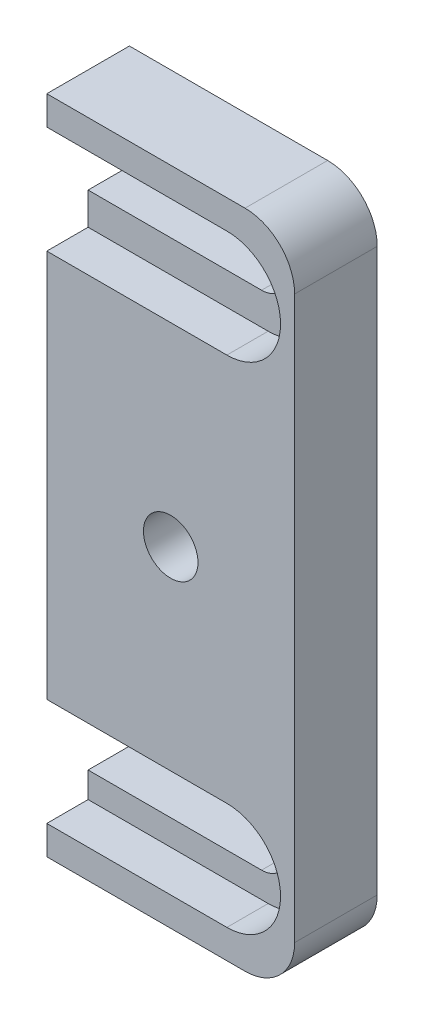
ISO-10303-21;
HEADER;
FILE_DESCRIPTION(('STEP AP214'),'2;1');
FILE_NAME('part.step','',(''),(''),'','','');
FILE_SCHEMA(('AUTOMOTIVE_DESIGN { 1 0 10303 214 1 1 1 1 }'));
ENDSEC;
DATA;
#1=APPLICATION_CONTEXT('core data for automotive mechanical design processes');
#2=APPLICATION_PROTOCOL_DEFINITION('international standard','automotive_design',2000,#1);
#3=PRODUCT_CONTEXT('',#1,'mechanical');
#4=PRODUCT('Part','Part','',(#3));
#5=PRODUCT_RELATED_PRODUCT_CATEGORY('part','',(#4));
#6=PRODUCT_DEFINITION_FORMATION('','',#4);
#7=PRODUCT_DEFINITION_CONTEXT('part definition',#1,'design');
#8=PRODUCT_DEFINITION('design','',#6,#7);
#9=PRODUCT_DEFINITION_SHAPE('','',#8);
#10=(LENGTH_UNIT() NAMED_UNIT(*) SI_UNIT(.MILLI.,.METRE.));
#11=(NAMED_UNIT(*) PLANE_ANGLE_UNIT() SI_UNIT($,.RADIAN.));
#12=(NAMED_UNIT(*) SI_UNIT($,.STERADIAN.) SOLID_ANGLE_UNIT());
#13=UNCERTAINTY_MEASURE_WITH_UNIT(LENGTH_MEASURE(1.E-05),#10,'distance_accuracy_value','');
#14=(GEOMETRIC_REPRESENTATION_CONTEXT(3) GLOBAL_UNCERTAINTY_ASSIGNED_CONTEXT((#13)) GLOBAL_UNIT_ASSIGNED_CONTEXT((#10,
#11,#12)) REPRESENTATION_CONTEXT('',''));
#15=CARTESIAN_POINT('',(0.,0.,0.));
#16=DIRECTION('',(0.,0.,1.));
#17=DIRECTION('',(1.,0.,0.));
#18=AXIS2_PLACEMENT_3D('',#15,#16,#17);
#19=CARTESIAN_POINT('',(-7.50000000000001,16.7,5.));
#20=DIRECTION('',(1.,0.,0.));
#21=DIRECTION('',(0.,1.,0.));
#22=AXIS2_PLACEMENT_3D('',#19,#20,#21);
#23=PLANE('',#22);
#24=DIRECTION('',(0.,0.,1.));
#25=VECTOR('',#24,1.);
#26=CARTESIAN_POINT('',(-7.5,18.25,2.5));
#27=LINE('',#26,#25);
#28=CARTESIAN_POINT('',(-7.5,18.25,2.5));
#29=VERTEX_POINT('',#28);
#30=CARTESIAN_POINT('',(-7.5,18.25,5.));
#31=VERTEX_POINT('',#30);
#32=EDGE_CURVE('E265',#29,#31,#27,.T.);
#33=ORIENTED_EDGE('',*,*,#32,.T.);
#34=DIRECTION('',(0.,-1.,0.));
#35=VECTOR('',#34,1.);
#36=CARTESIAN_POINT('',(-7.50000000000001,16.7,5.));
#37=LINE('',#36,#35);
#38=CARTESIAN_POINT('',(-7.5,20.,5.));
#39=VERTEX_POINT('',#38);
#40=EDGE_CURVE('E288',#39,#31,#37,.T.);
#41=ORIENTED_EDGE('',*,*,#40,.F.);
#42=DIRECTION('',(0.,0.,-1.));
#43=VECTOR('',#42,1.);
#44=CARTESIAN_POINT('',(-7.5,20.,5.));
#45=LINE('',#44,#43);
#46=CARTESIAN_POINT('',(-7.5,20.,0.));
#47=VERTEX_POINT('',#46);
#48=EDGE_CURVE('E345',#39,#47,#45,.T.);
#49=ORIENTED_EDGE('',*,*,#48,.T.);
#50=DIRECTION('',(0.,-1.,0.));
#51=VECTOR('',#50,1.);
#52=CARTESIAN_POINT('',(-7.50000000000001,16.7,0.));
#53=LINE('',#52,#51);
#54=CARTESIAN_POINT('',(-7.50000000000001,16.7,0.));
#55=VERTEX_POINT('',#54);
#56=EDGE_CURVE('E307',#47,#55,#53,.T.);
#57=ORIENTED_EDGE('',*,*,#56,.T.);
#58=DIRECTION('',(0.,0.,-1.));
#59=VECTOR('',#58,1.);
#60=CARTESIAN_POINT('',(-7.50000000000001,16.7,5.));
#61=LINE('',#60,#59);
#62=CARTESIAN_POINT('',(-7.50000000000001,16.7,2.5));
#63=VERTEX_POINT('',#62);
#64=EDGE_CURVE('E343',#63,#55,#61,.T.);
#65=ORIENTED_EDGE('',*,*,#64,.F.);
#66=DIRECTION('',(0.,-1.,0.));
#67=VECTOR('',#66,1.);
#68=CARTESIAN_POINT('',(-7.50000000000003,0.,2.5));
#69=LINE('',#68,#67);
#70=EDGE_CURVE('E241',#29,#63,#69,.T.);
#71=ORIENTED_EDGE('',*,*,#70,.F.);
#72=EDGE_LOOP('',(#33,#41,#49,#57,#65,#71));
#73=FACE_BOUND('',#72,.T.);
#74=ADVANCED_FACE('F39',(#73),#23,.F.);
#75=CARTESIAN_POINT('',(-7.50000000000001,16.7,5.));
#76=DIRECTION('',(0.,1.,0.));
#77=DIRECTION('',(0.,0.,1.));
#78=AXIS2_PLACEMENT_3D('',#75,#76,#77);
#79=PLANE('',#78);
#80=DIRECTION('',(1.,0.,0.));
#81=VECTOR('',#80,1.);
#82=CARTESIAN_POINT('',(0.,16.7,2.5));
#83=LINE('',#82,#81);
#84=CARTESIAN_POINT('',(2.99999999999999,16.7,2.5));
#85=VERTEX_POINT('',#84);
#86=EDGE_CURVE('E243',#63,#85,#83,.T.);
#87=ORIENTED_EDGE('',*,*,#86,.F.);
#88=ORIENTED_EDGE('',*,*,#64,.T.);
#89=DIRECTION('',(1.,0.,0.));
#90=VECTOR('',#89,1.);
#91=CARTESIAN_POINT('',(-7.50000000000001,16.7,0.));
#92=LINE('',#91,#90);
#93=CARTESIAN_POINT('',(2.99999999999999,16.7,0.));
#94=VERTEX_POINT('',#93);
#95=EDGE_CURVE('E310',#55,#94,#92,.T.);
#96=ORIENTED_EDGE('',*,*,#95,.T.);
#97=DIRECTION('',(0.,0.,-1.));
#98=VECTOR('',#97,1.);
#99=CARTESIAN_POINT('',(2.99999999999999,16.7,5.));
#100=LINE('',#99,#98);
#101=EDGE_CURVE('E341',#85,#94,#100,.T.);
#102=ORIENTED_EDGE('',*,*,#101,.F.);
#103=EDGE_LOOP('',(#87,#88,#96,#102));
#104=FACE_BOUND('',#103,.T.);
#105=ADVANCED_FACE('F422',(#104),#79,.F.);
#106=CARTESIAN_POINT('',(3.,15.2,5.));
#107=DIRECTION('',(0.,0.,-1.));
#108=DIRECTION('',(-1.,0.,0.));
#109=AXIS2_PLACEMENT_3D('',#106,#107,#108);
#110=CYLINDRICAL_SURFACE('',#109,1.5);
#111=CARTESIAN_POINT('',(3.,15.2,2.5));
#112=DIRECTION('',(0.,0.,1.));
#113=DIRECTION('',(1.,0.,0.));
#114=AXIS2_PLACEMENT_3D('',#111,#112,#113);
#115=CIRCLE('',#114,1.5);
#116=CARTESIAN_POINT('',(3.,13.7,2.5));
#117=VERTEX_POINT('',#116);
#118=EDGE_CURVE('E245',#85,#117,#115,.F.);
#119=ORIENTED_EDGE('',*,*,#118,.F.);
#120=ORIENTED_EDGE('',*,*,#101,.T.);
#121=CARTESIAN_POINT('',(3.,15.2,0.));
#122=DIRECTION('',(0.,0.,-1.));
#123=DIRECTION('',(1.,0.,0.));
#124=AXIS2_PLACEMENT_3D('',#121,#122,#123);
#125=CIRCLE('',#124,1.5);
#126=CARTESIAN_POINT('',(3.,13.7,0.));
#127=VERTEX_POINT('',#126);
#128=EDGE_CURVE('E313',#94,#127,#125,.T.);
#129=ORIENTED_EDGE('',*,*,#128,.T.);
#130=DIRECTION('',(0.,0.,-1.));
#131=VECTOR('',#130,1.);
#132=CARTESIAN_POINT('',(3.,13.7,5.));
#133=LINE('',#132,#131);
#134=EDGE_CURVE('E339',#117,#127,#133,.T.);
#135=ORIENTED_EDGE('',*,*,#134,.F.);
#136=EDGE_LOOP('',(#119,#120,#129,#135));
#137=FACE_BOUND('',#136,.T.);
#138=ADVANCED_FACE('F416',(#137),#110,.F.);
#139=CARTESIAN_POINT('',(-7.5,13.7,5.));
#140=DIRECTION('',(0.,-1.,0.));
#141=DIRECTION('',(1.,0.,0.));
#142=AXIS2_PLACEMENT_3D('',#139,#140,#141);
#143=PLANE('',#142);
#144=DIRECTION('',(-1.,0.,0.));
#145=VECTOR('',#144,1.);
#146=CARTESIAN_POINT('',(0.,13.7,2.5));
#147=LINE('',#146,#145);
#148=CARTESIAN_POINT('',(-7.5,13.7,2.5));
#149=VERTEX_POINT('',#148);
#150=EDGE_CURVE('E54',#117,#149,#147,.T.);
#151=ORIENTED_EDGE('',*,*,#150,.F.);
#152=ORIENTED_EDGE('',*,*,#134,.T.);
#153=DIRECTION('',(-1.,0.,0.));
#154=VECTOR('',#153,1.);
#155=CARTESIAN_POINT('',(-7.5,13.7,0.));
#156=LINE('',#155,#154);
#157=CARTESIAN_POINT('',(-7.5,13.7,0.));
#158=VERTEX_POINT('',#157);
#159=EDGE_CURVE('E316',#127,#158,#156,.T.);
#160=ORIENTED_EDGE('',*,*,#159,.T.);
#161=DIRECTION('',(0.,0.,-1.));
#162=VECTOR('',#161,1.);
#163=CARTESIAN_POINT('',(-7.5,13.7,5.));
#164=LINE('',#163,#162);
#165=EDGE_CURVE('E337',#149,#158,#164,.T.);
#166=ORIENTED_EDGE('',*,*,#165,.F.);
#167=EDGE_LOOP('',(#151,#152,#160,#166));
#168=FACE_BOUND('',#167,.T.);
#169=ADVANCED_FACE('F412',(#168),#143,.F.);
#170=CARTESIAN_POINT('',(-7.5,-13.7,5.));
#171=DIRECTION('',(1.,0.,0.));
#172=DIRECTION('',(0.,0.,-1.));
#173=AXIS2_PLACEMENT_3D('',#170,#171,#172);
#174=PLANE('',#173);
#175=DIRECTION('',(0.,0.,1.));
#176=VECTOR('',#175,1.);
#177=CARTESIAN_POINT('',(-7.5,-11.75,2.5));
#178=LINE('',#177,#176);
#179=CARTESIAN_POINT('',(-7.5,-11.75,2.5));
#180=VERTEX_POINT('',#179);
#181=CARTESIAN_POINT('',(-7.5,-11.75,5.));
#182=VERTEX_POINT('',#181);
#183=EDGE_CURVE('E232',#180,#182,#178,.T.);
#184=ORIENTED_EDGE('',*,*,#183,.T.);
#185=DIRECTION('',(0.,-1.,0.));
#186=VECTOR('',#185,1.);
#187=CARTESIAN_POINT('',(-7.5,-13.7,5.));
#188=LINE('',#187,#186);
#189=CARTESIAN_POINT('',(-7.5,11.75,5.));
#190=VERTEX_POINT('',#189);
#191=EDGE_CURVE('E291',#190,#182,#188,.T.);
#192=ORIENTED_EDGE('',*,*,#191,.F.);
#193=DIRECTION('',(0.,0.,1.));
#194=VECTOR('',#193,1.);
#195=CARTESIAN_POINT('',(-7.5,11.75,2.5));
#196=LINE('',#195,#194);
#197=CARTESIAN_POINT('',(-7.5,11.75,2.5));
#198=VERTEX_POINT('',#197);
#199=EDGE_CURVE('E263',#198,#190,#196,.T.);
#200=ORIENTED_EDGE('',*,*,#199,.F.);
#201=DIRECTION('',(0.,-1.,0.));
#202=VECTOR('',#201,1.);
#203=CARTESIAN_POINT('',(-7.5,0.,2.5));
#204=LINE('',#203,#202);
#205=EDGE_CURVE('E248',#149,#198,#204,.T.);
#206=ORIENTED_EDGE('',*,*,#205,.F.);
#207=ORIENTED_EDGE('',*,*,#165,.T.);
#208=DIRECTION('',(0.,-1.,0.));
#209=VECTOR('',#208,1.);
#210=CARTESIAN_POINT('',(-7.5,-13.7,0.));
#211=LINE('',#210,#209);
#212=CARTESIAN_POINT('',(-7.5,-13.7,0.));
#213=VERTEX_POINT('',#212);
#214=EDGE_CURVE('E319',#158,#213,#211,.T.);
#215=ORIENTED_EDGE('',*,*,#214,.T.);
#216=DIRECTION('',(0.,0.,-1.));
#217=VECTOR('',#216,1.);
#218=CARTESIAN_POINT('',(-7.5,-13.7,5.));
#219=LINE('',#218,#217);
#220=CARTESIAN_POINT('',(-7.5,-13.7,2.5));
#221=VERTEX_POINT('',#220);
#222=EDGE_CURVE('E335',#221,#213,#219,.T.);
#223=ORIENTED_EDGE('',*,*,#222,.F.);
#224=DIRECTION('',(0.,-1.,0.));
#225=VECTOR('',#224,1.);
#226=CARTESIAN_POINT('',(-7.5,0.,2.5));
#227=LINE('',#226,#225);
#228=EDGE_CURVE('E218',#180,#221,#227,.T.);
#229=ORIENTED_EDGE('',*,*,#228,.F.);
#230=EDGE_LOOP('',(#184,#192,#200,#206,#207,#215,#223,#229));
#231=FACE_BOUND('',#230,.T.);
#232=ADVANCED_FACE('F407',(#231),#174,.F.);
#233=CARTESIAN_POINT('',(-7.5,-13.7,5.));
#234=DIRECTION('',(0.,1.,0.));
#235=DIRECTION('',(0.,0.,1.));
#236=AXIS2_PLACEMENT_3D('',#233,#234,#235);
#237=PLANE('',#236);
#238=DIRECTION('',(1.,0.,0.));
#239=VECTOR('',#238,1.);
#240=CARTESIAN_POINT('',(0.,-13.7,2.5));
#241=LINE('',#240,#239);
#242=CARTESIAN_POINT('',(3.,-13.7,2.5));
#243=VERTEX_POINT('',#242);
#244=EDGE_CURVE('E220',#221,#243,#241,.T.);
#245=ORIENTED_EDGE('',*,*,#244,.F.);
#246=ORIENTED_EDGE('',*,*,#222,.T.);
#247=DIRECTION('',(1.,0.,0.));
#248=VECTOR('',#247,1.);
#249=CARTESIAN_POINT('',(-7.5,-13.7,0.));
#250=LINE('',#249,#248);
#251=CARTESIAN_POINT('',(3.,-13.7,0.));
#252=VERTEX_POINT('',#251);
#253=EDGE_CURVE('E322',#213,#252,#250,.T.);
#254=ORIENTED_EDGE('',*,*,#253,.T.);
#255=DIRECTION('',(0.,0.,-1.));
#256=VECTOR('',#255,1.);
#257=CARTESIAN_POINT('',(3.,-13.7,5.));
#258=LINE('',#257,#256);
#259=EDGE_CURVE('E333',#243,#252,#258,.T.);
#260=ORIENTED_EDGE('',*,*,#259,.F.);
#261=EDGE_LOOP('',(#245,#246,#254,#260));
#262=FACE_BOUND('',#261,.T.);
#263=ADVANCED_FACE('F401',(#262),#237,.F.);
#264=CARTESIAN_POINT('',(3.,-15.2,5.));
#265=DIRECTION('',(0.,0.,-1.));
#266=DIRECTION('',(-1.,0.,0.));
#267=AXIS2_PLACEMENT_3D('',#264,#265,#266);
#268=CYLINDRICAL_SURFACE('',#267,1.5);
#269=CARTESIAN_POINT('',(3.,-15.2,2.5));
#270=DIRECTION('',(0.,0.,1.));
#271=DIRECTION('',(1.,0.,0.));
#272=AXIS2_PLACEMENT_3D('',#269,#270,#271);
#273=CIRCLE('',#272,1.5);
#274=CARTESIAN_POINT('',(3.,-16.7,2.5));
#275=VERTEX_POINT('',#274);
#276=EDGE_CURVE('E62',#243,#275,#273,.F.);
#277=ORIENTED_EDGE('',*,*,#276,.F.);
#278=ORIENTED_EDGE('',*,*,#259,.T.);
#279=CARTESIAN_POINT('',(3.,-15.2,0.));
#280=DIRECTION('',(0.,0.,-1.));
#281=DIRECTION('',(-1.,0.,0.));
#282=AXIS2_PLACEMENT_3D('',#279,#280,#281);
#283=CIRCLE('',#282,1.5);
#284=CARTESIAN_POINT('',(3.,-16.7,0.));
#285=VERTEX_POINT('',#284);
#286=EDGE_CURVE('E325',#252,#285,#283,.T.);
#287=ORIENTED_EDGE('',*,*,#286,.T.);
#288=DIRECTION('',(0.,0.,-1.));
#289=VECTOR('',#288,1.);
#290=CARTESIAN_POINT('',(3.,-16.7,5.));
#291=LINE('',#290,#289);
#292=EDGE_CURVE('E331',#275,#285,#291,.T.);
#293=ORIENTED_EDGE('',*,*,#292,.F.);
#294=EDGE_LOOP('',(#277,#278,#287,#293));
#295=FACE_BOUND('',#294,.T.);
#296=ADVANCED_FACE('F397',(#295),#268,.F.);
#297=CARTESIAN_POINT('',(-7.5,-16.7,5.));
#298=DIRECTION('',(0.,-1.,0.));
#299=DIRECTION('',(0.,0.,-1.));
#300=AXIS2_PLACEMENT_3D('',#297,#298,#299);
#301=PLANE('',#300);
#302=DIRECTION('',(-1.,0.,0.));
#303=VECTOR('',#302,1.);
#304=CARTESIAN_POINT('',(0.,-16.7,2.5));
#305=LINE('',#304,#303);
#306=CARTESIAN_POINT('',(-7.5,-16.7,2.5));
#307=VERTEX_POINT('',#306);
#308=EDGE_CURVE('E223',#275,#307,#305,.T.);
#309=ORIENTED_EDGE('',*,*,#308,.F.);
#310=ORIENTED_EDGE('',*,*,#292,.T.);
#311=DIRECTION('',(-1.,0.,0.));
#312=VECTOR('',#311,1.);
#313=CARTESIAN_POINT('',(-7.5,-16.7,0.));
#314=LINE('',#313,#312);
#315=CARTESIAN_POINT('',(-7.5,-16.7,0.));
#316=VERTEX_POINT('',#315);
#317=EDGE_CURVE('E278',#285,#316,#314,.T.);
#318=ORIENTED_EDGE('',*,*,#317,.T.);
#319=DIRECTION('',(0.,0.,-1.));
#320=VECTOR('',#319,1.);
#321=CARTESIAN_POINT('',(-7.5,-16.7,5.));
#322=LINE('',#321,#320);
#323=EDGE_CURVE('E294',#307,#316,#322,.T.);
#324=ORIENTED_EDGE('',*,*,#323,.F.);
#325=EDGE_LOOP('',(#309,#310,#318,#324));
#326=FACE_BOUND('',#325,.T.);
#327=ADVANCED_FACE('F394',(#326),#301,.F.);
#328=CARTESIAN_POINT('',(3.,-15.2,5.));
#329=DIRECTION('',(0.,0.,-1.));
#330=DIRECTION('',(-1.,0.,0.));
#331=AXIS2_PLACEMENT_3D('',#328,#329,#330);
#332=PLANE('',#331);
#333=CARTESIAN_POINT('',(3.4,-15.,5.));
#334=DIRECTION('',(0.,0.,1.));
#335=DIRECTION('',(1.,0.,0.));
#336=AXIS2_PLACEMENT_3D('',#333,#334,#335);
#337=CIRCLE('',#336,3.25);
#338=CARTESIAN_POINT('',(3.4,-18.25,5.));
#339=VERTEX_POINT('',#338);
#340=CARTESIAN_POINT('',(3.4,-11.75,5.));
#341=VERTEX_POINT('',#340);
#342=EDGE_CURVE('E214',#339,#341,#337,.T.);
#343=ORIENTED_EDGE('',*,*,#342,.F.);
#344=DIRECTION('',(1.,0.,0.));
#345=VECTOR('',#344,1.);
#346=CARTESIAN_POINT('',(0.,-18.25,5.));
#347=LINE('',#346,#345);
#348=CARTESIAN_POINT('',(-7.5,-18.25,5.));
#349=VERTEX_POINT('',#348);
#350=EDGE_CURVE('E194',#349,#339,#347,.T.);
#351=ORIENTED_EDGE('',*,*,#350,.F.);
#352=DIRECTION('',(0.,-1.,0.));
#353=VECTOR('',#352,1.);
#354=CARTESIAN_POINT('',(-7.5,-20.,5.));
#355=LINE('',#354,#353);
#356=CARTESIAN_POINT('',(-7.5,-20.,5.));
#357=VERTEX_POINT('',#356);
#358=EDGE_CURVE('E275',#349,#357,#355,.T.);
#359=ORIENTED_EDGE('',*,*,#358,.T.);
#360=DIRECTION('',(1.,0.,0.));
#361=VECTOR('',#360,1.);
#362=CARTESIAN_POINT('',(-7.5,-20.,5.));
#363=LINE('',#362,#361);
#364=CARTESIAN_POINT('',(4.49999999999998,-20.,5.));
#365=VERTEX_POINT('',#364);
#366=EDGE_CURVE('E277',#357,#365,#363,.T.);
#367=ORIENTED_EDGE('',*,*,#366,.T.);
#368=CARTESIAN_POINT('',(4.5,-17.,5.));
#369=DIRECTION('',(0.,0.,1.));
#370=DIRECTION('',(-1.,0.,0.));
#371=AXIS2_PLACEMENT_3D('',#368,#369,#370);
#372=CIRCLE('',#371,3.);
#373=CARTESIAN_POINT('',(7.5,-17.,5.));
#374=VERTEX_POINT('',#373);
#375=EDGE_CURVE('E280',#365,#374,#372,.T.);
#376=ORIENTED_EDGE('',*,*,#375,.T.);
#377=DIRECTION('',(0.,1.,0.));
#378=VECTOR('',#377,1.);
#379=CARTESIAN_POINT('',(7.5,-17.,5.));
#380=LINE('',#379,#378);
#381=CARTESIAN_POINT('',(7.5,17.,5.));
#382=VERTEX_POINT('',#381);
#383=EDGE_CURVE('E282',#374,#382,#380,.T.);
#384=ORIENTED_EDGE('',*,*,#383,.T.);
#385=CARTESIAN_POINT('',(4.5,17.,5.));
#386=DIRECTION('',(0.,0.,1.));
#387=DIRECTION('',(1.,0.,0.));
#388=AXIS2_PLACEMENT_3D('',#385,#386,#387);
#389=CIRCLE('',#388,3.);
#390=CARTESIAN_POINT('',(4.49999999999998,20.,5.));
#391=VERTEX_POINT('',#390);
#392=EDGE_CURVE('E284',#382,#391,#389,.T.);
#393=ORIENTED_EDGE('',*,*,#392,.T.);
#394=DIRECTION('',(-1.,0.,0.));
#395=VECTOR('',#394,1.);
#396=CARTESIAN_POINT('',(-7.5,20.,5.));
#397=LINE('',#396,#395);
#398=EDGE_CURVE('E286',#391,#39,#397,.T.);
#399=ORIENTED_EDGE('',*,*,#398,.T.);
#400=ORIENTED_EDGE('',*,*,#40,.T.);
#401=DIRECTION('',(1.,0.,0.));
#402=VECTOR('',#401,1.);
#403=CARTESIAN_POINT('',(0.,18.25,5.));
#404=LINE('',#403,#402);
#405=CARTESIAN_POINT('',(3.4,18.25,5.));
#406=VERTEX_POINT('',#405);
#407=EDGE_CURVE('E257',#31,#406,#404,.T.);
#408=ORIENTED_EDGE('',*,*,#407,.T.);
#409=CARTESIAN_POINT('',(3.4,15.,5.));
#410=DIRECTION('',(0.,0.,1.));
#411=DIRECTION('',(1.,0.,0.));
#412=AXIS2_PLACEMENT_3D('',#409,#410,#411);
#413=CIRCLE('',#412,3.25);
#414=CARTESIAN_POINT('',(3.4,11.75,5.));
#415=VERTEX_POINT('',#414);
#416=EDGE_CURVE('E254',#406,#415,#413,.F.);
#417=ORIENTED_EDGE('',*,*,#416,.T.);
#418=DIRECTION('',(1.,0.,0.));
#419=VECTOR('',#418,1.);
#420=CARTESIAN_POINT('',(0.,11.75,5.));
#421=LINE('',#420,#419);
#422=EDGE_CURVE('E239',#190,#415,#421,.T.);
#423=ORIENTED_EDGE('',*,*,#422,.F.);
#424=ORIENTED_EDGE('',*,*,#191,.T.);
#425=DIRECTION('',(1.,0.,0.));
#426=VECTOR('',#425,1.);
#427=CARTESIAN_POINT('',(0.,-11.75,5.));
#428=LINE('',#427,#426);
#429=EDGE_CURVE('E211',#182,#341,#428,.T.);
#430=ORIENTED_EDGE('',*,*,#429,.T.);
#431=EDGE_LOOP('',(#343,#351,#359,#367,#376,#384,#393,#399,#400,#408,#417,#423,#424,#430));
#432=FACE_BOUND('',#431,.T.);
#433=CARTESIAN_POINT('',(0.,0.,5.));
#434=DIRECTION('',(0.,0.,1.));
#435=DIRECTION('',(1.,0.,0.));
#436=AXIS2_PLACEMENT_3D('',#433,#434,#435);
#437=CIRCLE('',#436,1.65);
#438=CARTESIAN_POINT('',(1.65,0.,5.));
#439=VERTEX_POINT('',#438);
#440=EDGE_CURVE('E269',#439,#439,#437,.T.);
#441=ORIENTED_EDGE('',*,*,#440,.F.);
#442=EDGE_LOOP('',(#441));
#443=FACE_BOUND('',#442,.T.);
#444=ADVANCED_FACE('F382',(#432,#443),#332,.F.);
#445=CARTESIAN_POINT('',(3.,-15.2,0.));
#446=DIRECTION('',(0.,0.,-1.));
#447=DIRECTION('',(-1.,0.,0.));
#448=AXIS2_PLACEMENT_3D('',#445,#446,#447);
#449=PLANE('',#448);
#450=DIRECTION('',(0.,-1.,0.));
#451=VECTOR('',#450,1.);
#452=CARTESIAN_POINT('',(-7.5,-20.,0.));
#453=LINE('',#452,#451);
#454=CARTESIAN_POINT('',(-7.5,-20.,0.));
#455=VERTEX_POINT('',#454);
#456=EDGE_CURVE('E272',#316,#455,#453,.T.);
#457=ORIENTED_EDGE('',*,*,#456,.F.);
#458=ORIENTED_EDGE('',*,*,#317,.F.);
#459=ORIENTED_EDGE('',*,*,#286,.F.);
#460=ORIENTED_EDGE('',*,*,#253,.F.);
#461=ORIENTED_EDGE('',*,*,#214,.F.);
#462=ORIENTED_EDGE('',*,*,#159,.F.);
#463=ORIENTED_EDGE('',*,*,#128,.F.);
#464=ORIENTED_EDGE('',*,*,#95,.F.);
#465=ORIENTED_EDGE('',*,*,#56,.F.);
#466=DIRECTION('',(-1.,0.,0.));
#467=VECTOR('',#466,1.);
#468=CARTESIAN_POINT('',(-7.5,20.,0.));
#469=LINE('',#468,#467);
#470=CARTESIAN_POINT('',(4.49999999999998,20.,0.));
#471=VERTEX_POINT('',#470);
#472=EDGE_CURVE('E305',#471,#47,#469,.T.);
#473=ORIENTED_EDGE('',*,*,#472,.F.);
#474=CARTESIAN_POINT('',(4.5,17.,0.));
#475=DIRECTION('',(0.,0.,1.));
#476=DIRECTION('',(1.,0.,0.));
#477=AXIS2_PLACEMENT_3D('',#474,#475,#476);
#478=CIRCLE('',#477,3.);
#479=CARTESIAN_POINT('',(7.5,17.,0.));
#480=VERTEX_POINT('',#479);
#481=EDGE_CURVE('E303',#480,#471,#478,.T.);
#482=ORIENTED_EDGE('',*,*,#481,.F.);
#483=DIRECTION('',(0.,1.,0.));
#484=VECTOR('',#483,1.);
#485=CARTESIAN_POINT('',(7.5,-17.,0.));
#486=LINE('',#485,#484);
#487=CARTESIAN_POINT('',(7.5,-17.,0.));
#488=VERTEX_POINT('',#487);
#489=EDGE_CURVE('E301',#488,#480,#486,.T.);
#490=ORIENTED_EDGE('',*,*,#489,.F.);
#491=CARTESIAN_POINT('',(4.5,-17.,0.));
#492=DIRECTION('',(0.,0.,1.));
#493=DIRECTION('',(-1.,0.,0.));
#494=AXIS2_PLACEMENT_3D('',#491,#492,#493);
#495=CIRCLE('',#494,3.);
#496=CARTESIAN_POINT('',(4.49999999999998,-20.,0.));
#497=VERTEX_POINT('',#496);
#498=EDGE_CURVE('E299',#497,#488,#495,.T.);
#499=ORIENTED_EDGE('',*,*,#498,.F.);
#500=DIRECTION('',(1.,0.,0.));
#501=VECTOR('',#500,1.);
#502=CARTESIAN_POINT('',(-7.5,-20.,0.));
#503=LINE('',#502,#501);
#504=EDGE_CURVE('E297',#455,#497,#503,.T.);
#505=ORIENTED_EDGE('',*,*,#504,.F.);
#506=EDGE_LOOP('',(#457,#458,#459,#460,#461,#462,#463,#464,#465,#473,#482,#490,#499,#505));
#507=FACE_BOUND('',#506,.T.);
#508=CARTESIAN_POINT('',(0.,0.,0.));
#509=DIRECTION('',(0.,0.,1.));
#510=DIRECTION('',(1.,0.,0.));
#511=AXIS2_PLACEMENT_3D('',#508,#509,#510);
#512=CIRCLE('',#511,1.65);
#513=CARTESIAN_POINT('',(1.65,0.,0.));
#514=VERTEX_POINT('',#513);
#515=EDGE_CURVE('E231',#514,#514,#512,.T.);
#516=ORIENTED_EDGE('',*,*,#515,.T.);
#517=EDGE_LOOP('',(#516));
#518=FACE_BOUND('',#517,.T.);
#519=ADVANCED_FACE('F368',(#507,#518),#449,.T.);
#520=CARTESIAN_POINT('',(-7.5,-20.,5.));
#521=DIRECTION('',(1.,0.,0.));
#522=DIRECTION('',(0.,1.,0.));
#523=AXIS2_PLACEMENT_3D('',#520,#521,#522);
#524=PLANE('',#523);
#525=ORIENTED_EDGE('',*,*,#358,.F.);
#526=DIRECTION('',(0.,0.,1.));
#527=VECTOR('',#526,1.);
#528=CARTESIAN_POINT('',(-7.5,-18.25,2.5));
#529=LINE('',#528,#527);
#530=CARTESIAN_POINT('',(-7.5,-18.25,2.5));
#531=VERTEX_POINT('',#530);
#532=EDGE_CURVE('E229',#531,#349,#529,.T.);
#533=ORIENTED_EDGE('',*,*,#532,.F.);
#534=DIRECTION('',(0.,-1.,0.));
#535=VECTOR('',#534,1.);
#536=CARTESIAN_POINT('',(-7.50000000000001,0.,2.5));
#537=LINE('',#536,#535);
#538=EDGE_CURVE('E199',#307,#531,#537,.T.);
#539=ORIENTED_EDGE('',*,*,#538,.F.);
#540=ORIENTED_EDGE('',*,*,#323,.T.);
#541=ORIENTED_EDGE('',*,*,#456,.T.);
#542=DIRECTION('',(0.,0.,-1.));
#543=VECTOR('',#542,1.);
#544=CARTESIAN_POINT('',(-7.5,-20.,5.));
#545=LINE('',#544,#543);
#546=EDGE_CURVE('E11',#357,#455,#545,.T.);
#547=ORIENTED_EDGE('',*,*,#546,.F.);
#548=EDGE_LOOP('',(#525,#533,#539,#540,#541,#547));
#549=FACE_BOUND('',#548,.T.);
#550=ADVANCED_FACE('F41',(#549),#524,.F.);
#551=CARTESIAN_POINT('',(-7.5,-20.,5.));
#552=DIRECTION('',(0.,1.,0.));
#553=DIRECTION('',(0.,0.,1.));
#554=AXIS2_PLACEMENT_3D('',#551,#552,#553);
#555=PLANE('',#554);
#556=ORIENTED_EDGE('',*,*,#504,.T.);
#557=DIRECTION('',(0.,0.,-1.));
#558=VECTOR('',#557,1.);
#559=CARTESIAN_POINT('',(4.49999999999998,-20.,5.));
#560=LINE('',#559,#558);
#561=EDGE_CURVE('E47',#365,#497,#560,.T.);
#562=ORIENTED_EDGE('',*,*,#561,.F.);
#563=ORIENTED_EDGE('',*,*,#366,.F.);
#564=ORIENTED_EDGE('',*,*,#546,.T.);
#565=EDGE_LOOP('',(#556,#562,#563,#564));
#566=FACE_BOUND('',#565,.T.);
#567=ADVANCED_FACE('F387',(#566),#555,.F.);
#568=CARTESIAN_POINT('',(4.5,-17.,5.));
#569=DIRECTION('',(0.,0.,-1.));
#570=DIRECTION('',(-1.,0.,0.));
#571=AXIS2_PLACEMENT_3D('',#568,#569,#570);
#572=CYLINDRICAL_SURFACE('',#571,3.);
#573=ORIENTED_EDGE('',*,*,#498,.T.);
#574=DIRECTION('',(0.,0.,-1.));
#575=VECTOR('',#574,1.);
#576=CARTESIAN_POINT('',(7.5,-17.,5.));
#577=LINE('',#576,#575);
#578=EDGE_CURVE('E354',#374,#488,#577,.T.);
#579=ORIENTED_EDGE('',*,*,#578,.F.);
#580=ORIENTED_EDGE('',*,*,#375,.F.);
#581=ORIENTED_EDGE('',*,*,#561,.T.);
#582=EDGE_LOOP('',(#573,#579,#580,#581));
#583=FACE_BOUND('',#582,.T.);
#584=ADVANCED_FACE('F361',(#583),#572,.T.);
#585=CARTESIAN_POINT('',(7.5,-17.,5.));
#586=DIRECTION('',(-1.,0.,0.));
#587=DIRECTION('',(0.,0.,1.));
#588=AXIS2_PLACEMENT_3D('',#585,#586,#587);
#589=PLANE('',#588);
#590=ORIENTED_EDGE('',*,*,#489,.T.);
#591=DIRECTION('',(0.,0.,-1.));
#592=VECTOR('',#591,1.);
#593=CARTESIAN_POINT('',(7.5,17.,5.));
#594=LINE('',#593,#592);
#595=EDGE_CURVE('E351',#382,#480,#594,.T.);
#596=ORIENTED_EDGE('',*,*,#595,.F.);
#597=ORIENTED_EDGE('',*,*,#383,.F.);
#598=ORIENTED_EDGE('',*,*,#578,.T.);
#599=EDGE_LOOP('',(#590,#596,#597,#598));
#600=FACE_BOUND('',#599,.T.);
#601=ADVANCED_FACE('F374',(#600),#589,.F.);
#602=CARTESIAN_POINT('',(4.5,17.,5.));
#603=DIRECTION('',(0.,0.,-1.));
#604=DIRECTION('',(-1.,0.,0.));
#605=AXIS2_PLACEMENT_3D('',#602,#603,#604);
#606=CYLINDRICAL_SURFACE('',#605,3.);
#607=ORIENTED_EDGE('',*,*,#481,.T.);
#608=DIRECTION('',(0.,0.,-1.));
#609=VECTOR('',#608,1.);
#610=CARTESIAN_POINT('',(4.49999999999998,20.,5.));
#611=LINE('',#610,#609);
#612=EDGE_CURVE('E348',#391,#471,#611,.T.);
#613=ORIENTED_EDGE('',*,*,#612,.F.);
#614=ORIENTED_EDGE('',*,*,#392,.F.);
#615=ORIENTED_EDGE('',*,*,#595,.T.);
#616=EDGE_LOOP('',(#607,#613,#614,#615));
#617=FACE_BOUND('',#616,.T.);
#618=ADVANCED_FACE('F378',(#617),#606,.T.);
#619=CARTESIAN_POINT('',(-7.5,20.,5.));
#620=DIRECTION('',(0.,-1.,0.));
#621=DIRECTION('',(0.,0.,-1.));
#622=AXIS2_PLACEMENT_3D('',#619,#620,#621);
#623=PLANE('',#622);
#624=ORIENTED_EDGE('',*,*,#472,.T.);
#625=ORIENTED_EDGE('',*,*,#48,.F.);
#626=ORIENTED_EDGE('',*,*,#398,.F.);
#627=ORIENTED_EDGE('',*,*,#612,.T.);
#628=EDGE_LOOP('',(#624,#625,#626,#627));
#629=FACE_BOUND('',#628,.T.);
#630=ADVANCED_FACE('F428',(#629),#623,.F.);
#631=CARTESIAN_POINT('',(0.,0.,5.));
#632=DIRECTION('',(0.,0.,-1.));
#633=DIRECTION('',(-1.,0.,0.));
#634=AXIS2_PLACEMENT_3D('',#631,#632,#633);
#635=CYLINDRICAL_SURFACE('',#634,1.65);
#636=ORIENTED_EDGE('',*,*,#440,.T.);
#637=EDGE_LOOP('',(#636));
#638=FACE_BOUND('',#637,.T.);
#639=ORIENTED_EDGE('',*,*,#515,.F.);
#640=EDGE_LOOP('',(#639));
#641=FACE_BOUND('',#640,.T.);
#642=ADVANCED_FACE('F430',(#638,#641),#635,.F.);
#643=CARTESIAN_POINT('',(0.,-18.25,2.5));
#644=DIRECTION('',(0.,-1.,0.));
#645=DIRECTION('',(0.,0.,-1.));
#646=AXIS2_PLACEMENT_3D('',#643,#644,#645);
#647=PLANE('',#646);
#648=ORIENTED_EDGE('',*,*,#350,.T.);
#649=DIRECTION('',(0.,0.,1.));
#650=VECTOR('',#649,1.);
#651=CARTESIAN_POINT('',(3.4,-18.25,2.5));
#652=LINE('',#651,#650);
#653=CARTESIAN_POINT('',(3.4,-18.25,2.5));
#654=VERTEX_POINT('',#653);
#655=EDGE_CURVE('E187',#654,#339,#652,.T.);
#656=ORIENTED_EDGE('',*,*,#655,.F.);
#657=DIRECTION('',(1.,0.,0.));
#658=VECTOR('',#657,1.);
#659=CARTESIAN_POINT('',(0.,-18.25,2.5));
#660=LINE('',#659,#658);
#661=EDGE_CURVE('E191',#531,#654,#660,.T.);
#662=ORIENTED_EDGE('',*,*,#661,.F.);
#663=ORIENTED_EDGE('',*,*,#532,.T.);
#664=EDGE_LOOP('',(#648,#656,#662,#663));
#665=FACE_BOUND('',#664,.T.);
#666=ADVANCED_FACE('F189',(#665),#647,.F.);
#667=CARTESIAN_POINT('',(0.,-11.75,2.5));
#668=DIRECTION('',(0.,-1.,0.));
#669=DIRECTION('',(0.,0.,-1.));
#670=AXIS2_PLACEMENT_3D('',#667,#668,#669);
#671=PLANE('',#670);
#672=ORIENTED_EDGE('',*,*,#429,.F.);
#673=ORIENTED_EDGE('',*,*,#183,.F.);
#674=DIRECTION('',(1.,0.,0.));
#675=VECTOR('',#674,1.);
#676=CARTESIAN_POINT('',(0.,-11.75,2.5));
#677=LINE('',#676,#675);
#678=CARTESIAN_POINT('',(3.4,-11.75,2.5));
#679=VERTEX_POINT('',#678);
#680=EDGE_CURVE('E206',#180,#679,#677,.T.);
#681=ORIENTED_EDGE('',*,*,#680,.T.);
#682=DIRECTION('',(0.,0.,1.));
#683=VECTOR('',#682,1.);
#684=CARTESIAN_POINT('',(3.4,-11.75,2.5));
#685=LINE('',#684,#683);
#686=EDGE_CURVE('E198',#679,#341,#685,.T.);
#687=ORIENTED_EDGE('',*,*,#686,.T.);
#688=EDGE_LOOP('',(#672,#673,#681,#687));
#689=FACE_BOUND('',#688,.T.);
#690=ADVANCED_FACE('F479',(#689),#671,.T.);
#691=CARTESIAN_POINT('',(3.4,-15.,2.5));
#692=DIRECTION('',(0.,0.,1.));
#693=DIRECTION('',(1.,0.,0.));
#694=AXIS2_PLACEMENT_3D('',#691,#692,#693);
#695=CYLINDRICAL_SURFACE('',#694,3.25);
#696=ORIENTED_EDGE('',*,*,#342,.T.);
#697=ORIENTED_EDGE('',*,*,#686,.F.);
#698=CARTESIAN_POINT('',(3.4,-15.,2.5));
#699=DIRECTION('',(0.,0.,1.));
#700=DIRECTION('',(1.,0.,0.));
#701=AXIS2_PLACEMENT_3D('',#698,#699,#700);
#702=CIRCLE('',#701,3.25);
#703=EDGE_CURVE('E203',#654,#679,#702,.T.);
#704=ORIENTED_EDGE('',*,*,#703,.F.);
#705=ORIENTED_EDGE('',*,*,#655,.T.);
#706=EDGE_LOOP('',(#696,#697,#704,#705));
#707=FACE_BOUND('',#706,.T.);
#708=ADVANCED_FACE('F204',(#707),#695,.F.);
#709=CARTESIAN_POINT('',(0.,0.,2.5));
#710=DIRECTION('',(0.,0.,1.));
#711=DIRECTION('',(1.,0.,0.));
#712=AXIS2_PLACEMENT_3D('',#709,#710,#711);
#713=PLANE('',#712);
#714=ORIENTED_EDGE('',*,*,#661,.T.);
#715=ORIENTED_EDGE('',*,*,#703,.T.);
#716=ORIENTED_EDGE('',*,*,#680,.F.);
#717=ORIENTED_EDGE('',*,*,#228,.T.);
#718=ORIENTED_EDGE('',*,*,#244,.T.);
#719=ORIENTED_EDGE('',*,*,#276,.T.);
#720=ORIENTED_EDGE('',*,*,#308,.T.);
#721=ORIENTED_EDGE('',*,*,#538,.T.);
#722=EDGE_LOOP('',(#714,#715,#716,#717,#718,#719,#720,#721));
#723=FACE_BOUND('',#722,.T.);
#724=ADVANCED_FACE('F208',(#723),#713,.T.);
#725=CARTESIAN_POINT('',(3.4,15.,2.5));
#726=DIRECTION('',(0.,0.,1.));
#727=DIRECTION('',(1.,0.,0.));
#728=AXIS2_PLACEMENT_3D('',#725,#726,#727);
#729=CYLINDRICAL_SURFACE('',#728,3.25);
#730=ORIENTED_EDGE('',*,*,#416,.F.);
#731=DIRECTION('',(0.,0.,1.));
#732=VECTOR('',#731,1.);
#733=CARTESIAN_POINT('',(3.4,18.25,2.5));
#734=LINE('',#733,#732);
#735=CARTESIAN_POINT('',(3.4,18.25,2.5));
#736=VERTEX_POINT('',#735);
#737=EDGE_CURVE('E253',#736,#406,#734,.T.);
#738=ORIENTED_EDGE('',*,*,#737,.F.);
#739=CARTESIAN_POINT('',(3.4,15.,2.5));
#740=DIRECTION('',(0.,0.,1.));
#741=DIRECTION('',(1.,0.,0.));
#742=AXIS2_PLACEMENT_3D('',#739,#740,#741);
#743=CIRCLE('',#742,3.25);
#744=CARTESIAN_POINT('',(3.4,11.75,2.5));
#745=VERTEX_POINT('',#744);
#746=EDGE_CURVE('E236',#736,#745,#743,.F.);
#747=ORIENTED_EDGE('',*,*,#746,.T.);
#748=DIRECTION('',(0.,0.,1.));
#749=VECTOR('',#748,1.);
#750=CARTESIAN_POINT('',(3.4,11.75,2.5));
#751=LINE('',#750,#749);
#752=EDGE_CURVE('E227',#745,#415,#751,.T.);
#753=ORIENTED_EDGE('',*,*,#752,.T.);
#754=EDGE_LOOP('',(#730,#738,#747,#753));
#755=FACE_BOUND('',#754,.T.);
#756=ADVANCED_FACE('F462',(#755),#729,.F.);
#757=CARTESIAN_POINT('',(0.,11.75,2.5));
#758=DIRECTION('',(0.,-1.,0.));
#759=DIRECTION('',(0.,0.,-1.));
#760=AXIS2_PLACEMENT_3D('',#757,#758,#759);
#761=PLANE('',#760);
#762=ORIENTED_EDGE('',*,*,#422,.T.);
#763=ORIENTED_EDGE('',*,*,#752,.F.);
#764=DIRECTION('',(1.,0.,0.));
#765=VECTOR('',#764,1.);
#766=CARTESIAN_POINT('',(0.,11.75,2.5));
#767=LINE('',#766,#765);
#768=EDGE_CURVE('E250',#198,#745,#767,.T.);
#769=ORIENTED_EDGE('',*,*,#768,.F.);
#770=ORIENTED_EDGE('',*,*,#199,.T.);
#771=EDGE_LOOP('',(#762,#763,#769,#770));
#772=FACE_BOUND('',#771,.T.);
#773=ADVANCED_FACE('F465',(#772),#761,.F.);
#774=CARTESIAN_POINT('',(0.,18.25,2.5));
#775=DIRECTION('',(0.,-1.,0.));
#776=DIRECTION('',(0.,0.,-1.));
#777=AXIS2_PLACEMENT_3D('',#774,#775,#776);
#778=PLANE('',#777);
#779=ORIENTED_EDGE('',*,*,#407,.F.);
#780=ORIENTED_EDGE('',*,*,#32,.F.);
#781=DIRECTION('',(1.,0.,0.));
#782=VECTOR('',#781,1.);
#783=CARTESIAN_POINT('',(0.,18.25,2.5));
#784=LINE('',#783,#782);
#785=EDGE_CURVE('E238',#29,#736,#784,.T.);
#786=ORIENTED_EDGE('',*,*,#785,.T.);
#787=ORIENTED_EDGE('',*,*,#737,.T.);
#788=EDGE_LOOP('',(#779,#780,#786,#787));
#789=FACE_BOUND('',#788,.T.);
#790=ADVANCED_FACE('F467',(#789),#778,.T.);
#791=CARTESIAN_POINT('',(0.,0.,2.5));
#792=DIRECTION('',(0.,0.,1.));
#793=DIRECTION('',(1.,0.,0.));
#794=AXIS2_PLACEMENT_3D('',#791,#792,#793);
#795=PLANE('',#794);
#796=ORIENTED_EDGE('',*,*,#746,.F.);
#797=ORIENTED_EDGE('',*,*,#785,.F.);
#798=ORIENTED_EDGE('',*,*,#70,.T.);
#799=ORIENTED_EDGE('',*,*,#86,.T.);
#800=ORIENTED_EDGE('',*,*,#118,.T.);
#801=ORIENTED_EDGE('',*,*,#150,.T.);
#802=ORIENTED_EDGE('',*,*,#205,.T.);
#803=ORIENTED_EDGE('',*,*,#768,.T.);
#804=EDGE_LOOP('',(#796,#797,#798,#799,#800,#801,#802,#803));
#805=FACE_BOUND('',#804,.T.);
#806=ADVANCED_FACE('F470',(#805),#795,.T.);
#807=CLOSED_SHELL('',(#74,#105,#138,#169,#232,#263,#296,#327,#444,#519,#550,#567,#584,#601,#618,
#630,#642,#666,#690,#708,#724,#756,#773,#790,#806));
#808=MANIFOLD_SOLID_BREP('B2',#807);
#809=ADVANCED_BREP_SHAPE_REPRESENTATION('',(#18,#808),#14);
#810=SHAPE_DEFINITION_REPRESENTATION(#9,#809);
ENDSEC;
END-ISO-10303-21;
